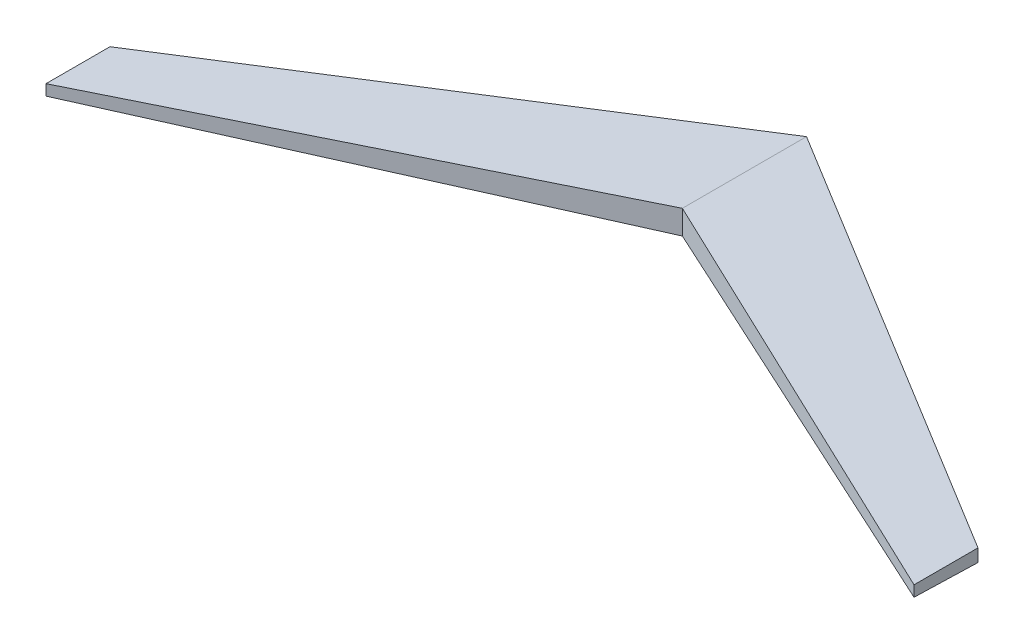
ISO-10303-21;
HEADER;
FILE_DESCRIPTION(('STEP AP214'),'2;1');
FILE_NAME('part.step','',(''),(''),'','','');
FILE_SCHEMA(('AUTOMOTIVE_DESIGN { 1 0 10303 214 1 1 1 1 }'));
ENDSEC;
DATA;
#1=APPLICATION_CONTEXT('core data for automotive mechanical design processes');
#2=APPLICATION_PROTOCOL_DEFINITION('international standard','automotive_design',2000,#1);
#3=PRODUCT_CONTEXT('',#1,'mechanical');
#4=PRODUCT('Part','Part','',(#3));
#5=PRODUCT_RELATED_PRODUCT_CATEGORY('part','',(#4));
#6=PRODUCT_DEFINITION_FORMATION('','',#4);
#7=PRODUCT_DEFINITION_CONTEXT('part definition',#1,'design');
#8=PRODUCT_DEFINITION('design','',#6,#7);
#9=PRODUCT_DEFINITION_SHAPE('','',#8);
#10=(LENGTH_UNIT() NAMED_UNIT(*) SI_UNIT(.MILLI.,.METRE.));
#11=(NAMED_UNIT(*) PLANE_ANGLE_UNIT() SI_UNIT($,.RADIAN.));
#12=(NAMED_UNIT(*) SI_UNIT($,.STERADIAN.) SOLID_ANGLE_UNIT());
#13=UNCERTAINTY_MEASURE_WITH_UNIT(LENGTH_MEASURE(1.E-05),#10,'distance_accuracy_value','');
#14=(GEOMETRIC_REPRESENTATION_CONTEXT(3) GLOBAL_UNCERTAINTY_ASSIGNED_CONTEXT((#13)) GLOBAL_UNIT_ASSIGNED_CONTEXT((#10,
#11,#12)) REPRESENTATION_CONTEXT('',''));
#15=CARTESIAN_POINT('',(0.,0.,0.));
#16=DIRECTION('',(0.,0.,1.));
#17=DIRECTION('',(1.,0.,0.));
#18=AXIS2_PLACEMENT_3D('',#15,#16,#17);
#19=CARTESIAN_POINT('',(-17711.940475464,-80.385008705711,13165.1515428862));
#20=CARTESIAN_POINT('',(0.,-298.277774528723,4907.09615841033));
#21=CARTESIAN_POINT('',(-17711.940475464,-85.1826870549582,12943.9386021868));
#22=CARTESIAN_POINT('',(0.,-321.894328297356,4276.67474022297));
#23=CARTESIAN_POINT('',(-17711.940475464,-89.9803654042046,12722.7256614874));
#24=CARTESIAN_POINT('',(0.,-345.510882065988,3646.25332203561));
#25=CARTESIAN_POINT('',(-17711.940475464,-99.5757221026959,12280.2997800886));
#26=CARTESIAN_POINT('',(0.,-392.743989603252,2385.41048566089));
#27=CARTESIAN_POINT('',(-17711.940475464,-104.373400451941,12059.0868393893));
#28=CARTESIAN_POINT('',(0.,-416.360543371884,1754.98906747353));
#29=CARTESIAN_POINT('',(-17711.940475464,-109.171078801185,11837.87389869));
#30=CARTESIAN_POINT('',(0.,-439.977097140517,1124.56764928617));
#31=B_SPLINE_SURFACE_WITH_KNOTS('',3,1,((#19,#20),(#21,#22),(#23,#24),(#25,#26),(#27,#28),(#29,
#30)),.UNSPECIFIED.,.F.,.F.,.F.,(4,2,4),(2,2),(0.,0.5,1.),(0.,1.),.UNSPECIFIED.);
#32=DIRECTION('',(0.906274153509529,-0.0111490088946297,-0.422543321188791));
#33=VECTOR('',#32,1.);
#34=CARTESIAN_POINT('',(-17711.940475464,-80.385008705711,13165.1515428862));
#35=LINE('',#34,#33);
#36=CARTESIAN_POINT('',(-13224.5432432146,-135.589089570586,11072.9372579865));
#37=VERTEX_POINT('',#36);
#38=CARTESIAN_POINT('',(0.,-298.277774528723,4907.09615841033));
#39=VERTEX_POINT('',#38);
#40=EDGE_CURVE('E231',#37,#39,#35,.T.);
#41=CARTESIAN_POINT('',(-13224.5432432146,-135.589089570586,11072.9372579865));
#42=CARTESIAN_POINT('',(-13224.5432432146,-145.154611939406,10748.0495679373));
#43=CARTESIAN_POINT('',(-13224.5432432146,-154.720134308226,10423.1618778881));
#44=CARTESIAN_POINT('',(-13224.5432432146,-169.068417861456,9935.83034281433));
#45=CARTESIAN_POINT('',(-13224.5432432146,-173.851179045866,9773.38649778973));
#46=CARTESIAN_POINT('',(-13224.5432432146,-183.416701414686,9448.49880774054));
#47=CARTESIAN_POINT('',(-13224.5432432146,-188.199462599097,9286.05496271594));
#48=CARTESIAN_POINT('',(-13224.5432432146,-192.982223783507,9123.61111769134));
#49=B_SPLINE_CURVE_WITH_KNOTS('',3,(#41,#42,#43,#44,#45,#46,#47,#48),.UNSPECIFIED.,.F.,.F.,(4,2,
2,4),(0.,975.085428705194,1462.6281430578,1950.17085741039),.UNSPECIFIED.);
#50=CARTESIAN_POINT('',(-13224.5432432146,-192.982223783507,9123.61111769134));
#51=VERTEX_POINT('',#50);
#52=EDGE_CURVE('E219',#37,#51,#49,.T.);
#53=DIRECTION('',(0.85554228604483,-0.0159789684004121,-0.517486298715285));
#54=VECTOR('',#53,1.);
#55=CARTESIAN_POINT('',(-8855.970237732,-274.574087970851,6481.22077398808));
#56=LINE('',#55,#54);
#57=CARTESIAN_POINT('',(0.,-439.977097140517,1124.56764928617));
#58=VERTEX_POINT('',#57);
#59=EDGE_CURVE('E113',#51,#58,#56,.T.);
#60=DIRECTION('',(0.,0.037435276099573,0.9992990543893));
#61=VECTOR('',#60,1.);
#62=CARTESIAN_POINT('',(0.,-369.12743583462,3015.83190384825));
#63=LINE('',#62,#61);
#64=EDGE_CURVE('E241',#58,#39,#63,.T.);
#65=ORIENTED_EDGE('',*,*,#40,.F.);
#66=ORIENTED_EDGE('',*,*,#52,.T.);
#67=ORIENTED_EDGE('',*,*,#59,.T.);
#68=ORIENTED_EDGE('',*,*,#64,.T.);
#69=EDGE_LOOP('',(#65,#66,#67,#68));
#70=FACE_BOUND('',#69,.T.);
#71=ADVANCED_FACE('F103',(#70),#31,.T.);
#72=CARTESIAN_POINT('',(1879.35745301163,-4.88727022556857E-12,4030.8602679557));
#73=DIRECTION('',(-0.422569584789028,0.,-0.906330483880592));
#74=DIRECTION('',(-0.906330483880592,0.,0.422569584789028));
#75=AXIS2_PLACEMENT_3D('',#72,#73,#74);
#76=PLANE('',#75);
#77=DIRECTION('',(0.,1.,0.));
#78=VECTOR('',#77,1.);
#79=CARTESIAN_POINT('',(-13224.5432432146,-1.34255302771863E-11,11072.9372579865));
#80=LINE('',#79,#78);
#81=CARTESIAN_POINT('',(-13224.5432432146,193.981843528122,11072.9372579865));
#82=VERTEX_POINT('',#81);
#83=EDGE_CURVE('E119',#37,#82,#80,.T.);
#84=ORIENTED_EDGE('',*,*,#83,.F.);
#85=ORIENTED_EDGE('',*,*,#40,.T.);
#86=DIRECTION('',(0.,-1.,0.));
#87=VECTOR('',#86,1.);
#88=CARTESIAN_POINT('',(0.,434.262669847546,4907.09615841033));
#89=LINE('',#88,#87);
#90=CARTESIAN_POINT('',(0.,434.262669847546,4907.09615841033));
#91=VERTEX_POINT('',#90);
#92=EDGE_CURVE('E239',#91,#39,#89,.T.);
#93=ORIENTED_EDGE('',*,*,#92,.F.);
#94=DIRECTION('',(0.90620762167093,0.016465167238481,-0.422512301233143));
#95=VECTOR('',#94,1.);
#96=CARTESIAN_POINT('',(-17711.940475464,112.448931944077,13165.1515428862));
#97=LINE('',#96,#95);
#98=EDGE_CURVE('E226',#82,#91,#97,.T.);
#99=ORIENTED_EDGE('',*,*,#98,.F.);
#100=EDGE_LOOP('',(#84,#85,#93,#99));
#101=FACE_BOUND('',#100,.T.);
#102=ADVANCED_FACE('F236',(#101),#76,.F.);
#103=CARTESIAN_POINT('',(498.008577383891,2.09116891696483E-13,823.340439781124));
#104=DIRECTION('',(0.517552375592634,0.,0.855651528671819));
#105=DIRECTION('',(0.855651528671819,0.,-0.517552375592634));
#106=AXIS2_PLACEMENT_3D('',#103,#104,#105);
#107=PLANE('',#106);
#108=DIRECTION('',(0.,-1.,0.));
#109=VECTOR('',#108,1.);
#110=CARTESIAN_POINT('',(-13224.5432432146,2.31726890335459E-12,9123.61111769134));
#111=LINE('',#110,#109);
#112=CARTESIAN_POINT('',(-13224.5432432146,193.981843528122,9123.61111769134));
#113=VERTEX_POINT('',#112);
#114=EDGE_CURVE('E169',#113,#51,#111,.T.);
#115=ORIENTED_EDGE('',*,*,#114,.F.);
#116=DIRECTION('',(0.85554814333413,0.01554471947013,-0.517489841575772));
#117=VECTOR('',#116,1.);
#118=CARTESIAN_POINT('',(-17711.940475464,112.448931944077,11837.87389869));
#119=LINE('',#118,#117);
#120=CARTESIAN_POINT('',(1.77635683940025E-12,434.262669847546,1124.56764928618));
#121=VERTEX_POINT('',#120);
#122=EDGE_CURVE('E228',#113,#121,#119,.T.);
#123=ORIENTED_EDGE('',*,*,#122,.T.);
#124=DIRECTION('',(0.,1.,0.));
#125=VECTOR('',#124,1.);
#126=CARTESIAN_POINT('',(0.,434.262669847546,1124.56764928617));
#127=LINE('',#126,#125);
#128=EDGE_CURVE('E177',#58,#121,#127,.T.);
#129=ORIENTED_EDGE('',*,*,#128,.F.);
#130=ORIENTED_EDGE('',*,*,#59,.F.);
#131=EDGE_LOOP('',(#115,#123,#129,#130));
#132=FACE_BOUND('',#131,.T.);
#133=ADVANCED_FACE('F257',(#132),#107,.F.);
#134=CARTESIAN_POINT('',(-7.88764918619134,434.119356703998,0.));
#135=DIRECTION('',(0.0181663117209599,-0.999834978943254,0.));
#136=DIRECTION('',(0.999834978943254,0.0181663117209599,0.));
#137=AXIS2_PLACEMENT_3D('',#134,#135,#136);
#138=PLANE('',#137);
#139=DIRECTION('',(0.,0.,-1.));
#140=VECTOR('',#139,1.);
#141=CARTESIAN_POINT('',(-13224.5432432146,193.981843528122,0.));
#142=LINE('',#141,#140);
#143=EDGE_CURVE('E13',#82,#113,#142,.T.);
#144=ORIENTED_EDGE('',*,*,#143,.F.);
#145=ORIENTED_EDGE('',*,*,#98,.T.);
#146=DIRECTION('',(0.,0.,1.));
#147=VECTOR('',#146,1.);
#148=CARTESIAN_POINT('',(0.,434.262669847546,4907.09615841033));
#149=LINE('',#148,#147);
#150=EDGE_CURVE('E178',#121,#91,#149,.T.);
#151=ORIENTED_EDGE('',*,*,#150,.F.);
#152=ORIENTED_EDGE('',*,*,#122,.F.);
#153=EDGE_LOOP('',(#144,#145,#151,#152));
#154=FACE_BOUND('',#153,.T.);
#155=ADVANCED_FACE('F216',(#154),#138,.F.);
#156=CARTESIAN_POINT('',(-13224.5432432146,0.,-2590.80000000001));
#157=DIRECTION('',(-1.,0.,0.));
#158=DIRECTION('',(0.,0.,1.));
#159=AXIS2_PLACEMENT_3D('',#156,#157,#158);
#160=PLANE('',#159);
#161=ORIENTED_EDGE('',*,*,#83,.T.);
#162=ORIENTED_EDGE('',*,*,#143,.T.);
#163=ORIENTED_EDGE('',*,*,#114,.T.);
#164=ORIENTED_EDGE('',*,*,#52,.F.);
#165=EDGE_LOOP('',(#161,#162,#163,#164));
#166=FACE_BOUND('',#165,.T.);
#167=ADVANCED_FACE('F205',(#166),#160,.T.);
#168=CARTESIAN_POINT('',(17711.940475464,-80.385008705711,13165.1515428862));
#169=CARTESIAN_POINT('',(0.,-298.277774528723,4907.09615841033));
#170=CARTESIAN_POINT('',(17711.940475464,-85.1826870549582,12943.9386021868));
#171=CARTESIAN_POINT('',(0.,-321.894328297356,4276.67474022297));
#172=CARTESIAN_POINT('',(17711.940475464,-89.9803654042046,12722.7256614874));
#173=CARTESIAN_POINT('',(0.,-345.510882065988,3646.25332203561));
#174=CARTESIAN_POINT('',(17711.940475464,-99.5757221026959,12280.2997800886));
#175=CARTESIAN_POINT('',(0.,-392.743989603252,2385.41048566089));
#176=CARTESIAN_POINT('',(17711.940475464,-104.373400451941,12059.0868393893));
#177=CARTESIAN_POINT('',(0.,-416.360543371884,1754.98906747353));
#178=CARTESIAN_POINT('',(17711.940475464,-109.171078801185,11837.87389869));
#179=CARTESIAN_POINT('',(0.,-439.977097140517,1124.56764928617));
#180=B_SPLINE_SURFACE_WITH_KNOTS('',3,1,((#168,#169),(#170,#171),(#172,#173),(#174,#175),(#176,
#177),(#178,#179)),.UNSPECIFIED.,.F.,.F.,.F.,(4,2,4),(2,2),(0.,0.5,1.),(0.,1.),.UNSPECIFIED.);
#181=DIRECTION('',(-0.906274153509529,-0.0111490088946297,-0.422543321188791));
#182=VECTOR('',#181,1.);
#183=CARTESIAN_POINT('',(17711.940475464,-80.385008705711,13165.1515428862));
#184=LINE('',#183,#182);
#185=CARTESIAN_POINT('',(13224.5432432146,-135.589089570586,11072.9372579865));
#186=VERTEX_POINT('',#185);
#187=EDGE_CURVE('E247',#186,#39,#184,.T.);
#188=DIRECTION('',(-0.85554228604483,-0.0159789684004121,-0.517486298715285));
#189=VECTOR('',#188,1.);
#190=CARTESIAN_POINT('',(8855.970237732,-274.574087970851,6481.22077398808));
#191=LINE('',#190,#189);
#192=CARTESIAN_POINT('',(13224.5432432146,-192.982223783507,9123.61111769134));
#193=VERTEX_POINT('',#192);
#194=EDGE_CURVE('E170',#193,#58,#191,.T.);
#195=CARTESIAN_POINT('',(13224.5432432146,-135.589089570586,11072.9372579865));
#196=CARTESIAN_POINT('',(13224.5432432146,-145.154611939406,10748.0495679373));
#197=CARTESIAN_POINT('',(13224.5432432146,-154.720134308226,10423.1618778881));
#198=CARTESIAN_POINT('',(13224.5432432146,-169.068417861456,9935.83034281433));
#199=CARTESIAN_POINT('',(13224.5432432146,-173.851179045866,9773.38649778973));
#200=CARTESIAN_POINT('',(13224.5432432146,-183.416701414686,9448.49880774054));
#201=CARTESIAN_POINT('',(13224.5432432146,-188.199462599097,9286.05496271594));
#202=CARTESIAN_POINT('',(13224.5432432146,-192.982223783507,9123.61111769134));
#203=B_SPLINE_CURVE_WITH_KNOTS('',3,(#195,#196,#197,#198,#199,#200,#201,#202),.UNSPECIFIED.,.F.,
.F.,(4,2,2,4),(0.,975.085428705194,1462.6281430578,1950.17085741039),.UNSPECIFIED.);
#204=EDGE_CURVE('E182',#186,#193,#203,.T.);
#205=ORIENTED_EDGE('',*,*,#187,.T.);
#206=ORIENTED_EDGE('',*,*,#64,.F.);
#207=ORIENTED_EDGE('',*,*,#194,.F.);
#208=ORIENTED_EDGE('',*,*,#204,.F.);
#209=EDGE_LOOP('',(#205,#206,#207,#208));
#210=FACE_BOUND('',#209,.T.);
#211=ADVANCED_FACE('F197',(#210),#180,.F.);
#212=CARTESIAN_POINT('',(-1879.35745301163,-4.88727022556857E-12,4030.8602679557));
#213=DIRECTION('',(0.422569584789028,0.,-0.906330483880592));
#214=DIRECTION('',(0.906330483880592,0.,0.422569584789028));
#215=AXIS2_PLACEMENT_3D('',#212,#213,#214);
#216=PLANE('',#215);
#217=DIRECTION('',(0.,1.,0.));
#218=VECTOR('',#217,1.);
#219=CARTESIAN_POINT('',(13224.5432432146,-1.34255302771863E-11,11072.9372579865));
#220=LINE('',#219,#218);
#221=CARTESIAN_POINT('',(13224.5432432146,193.981843528122,11072.9372579865));
#222=VERTEX_POINT('',#221);
#223=EDGE_CURVE('E184',#186,#222,#220,.T.);
#224=ORIENTED_EDGE('',*,*,#223,.T.);
#225=DIRECTION('',(-0.90620762167093,0.016465167238481,-0.422512301233143));
#226=VECTOR('',#225,1.);
#227=CARTESIAN_POINT('',(17711.940475464,112.448931944077,13165.1515428862));
#228=LINE('',#227,#226);
#229=EDGE_CURVE('E165',#222,#91,#228,.T.);
#230=ORIENTED_EDGE('',*,*,#229,.T.);
#231=ORIENTED_EDGE('',*,*,#92,.T.);
#232=ORIENTED_EDGE('',*,*,#187,.F.);
#233=EDGE_LOOP('',(#224,#230,#231,#232));
#234=FACE_BOUND('',#233,.T.);
#235=ADVANCED_FACE('F204',(#234),#216,.F.);
#236=CARTESIAN_POINT('',(-498.008577383891,2.09116891696483E-13,823.340439781124));
#237=DIRECTION('',(-0.517552375592634,0.,0.855651528671819));
#238=DIRECTION('',(-0.855651528671819,0.,-0.517552375592634));
#239=AXIS2_PLACEMENT_3D('',#236,#237,#238);
#240=PLANE('',#239);
#241=DIRECTION('',(0.,-1.,0.));
#242=VECTOR('',#241,1.);
#243=CARTESIAN_POINT('',(13224.5432432146,2.31726890335459E-12,9123.61111769134));
#244=LINE('',#243,#242);
#245=CARTESIAN_POINT('',(13224.5432432146,193.981843528122,9123.61111769134));
#246=VERTEX_POINT('',#245);
#247=EDGE_CURVE('E175',#246,#193,#244,.T.);
#248=ORIENTED_EDGE('',*,*,#247,.T.);
#249=ORIENTED_EDGE('',*,*,#194,.T.);
#250=ORIENTED_EDGE('',*,*,#128,.T.);
#251=DIRECTION('',(-0.85554814333413,0.01554471947013,-0.517489841575772));
#252=VECTOR('',#251,1.);
#253=CARTESIAN_POINT('',(17711.940475464,112.448931944077,11837.87389869));
#254=LINE('',#253,#252);
#255=EDGE_CURVE('E162',#246,#121,#254,.T.);
#256=ORIENTED_EDGE('',*,*,#255,.F.);
#257=EDGE_LOOP('',(#248,#249,#250,#256));
#258=FACE_BOUND('',#257,.T.);
#259=ADVANCED_FACE('F173',(#258),#240,.F.);
#260=CARTESIAN_POINT('',(7.88764918619134,434.119356703998,0.));
#261=DIRECTION('',(-0.0181663117209599,-0.999834978943254,0.));
#262=DIRECTION('',(-0.999834978943254,0.0181663117209599,0.));
#263=AXIS2_PLACEMENT_3D('',#260,#261,#262);
#264=PLANE('',#263);
#265=DIRECTION('',(0.,0.,-1.));
#266=VECTOR('',#265,1.);
#267=CARTESIAN_POINT('',(13224.5432432146,193.981843528122,0.));
#268=LINE('',#267,#266);
#269=EDGE_CURVE('E158',#222,#246,#268,.T.);
#270=ORIENTED_EDGE('',*,*,#269,.T.);
#271=ORIENTED_EDGE('',*,*,#255,.T.);
#272=ORIENTED_EDGE('',*,*,#150,.T.);
#273=ORIENTED_EDGE('',*,*,#229,.F.);
#274=EDGE_LOOP('',(#270,#271,#272,#273));
#275=FACE_BOUND('',#274,.T.);
#276=ADVANCED_FACE('F160',(#275),#264,.F.);
#277=CARTESIAN_POINT('',(13224.5432432146,0.,-2590.80000000001));
#278=DIRECTION('',(1.,0.,0.));
#279=DIRECTION('',(0.,0.,1.));
#280=AXIS2_PLACEMENT_3D('',#277,#278,#279);
#281=PLANE('',#280);
#282=ORIENTED_EDGE('',*,*,#223,.F.);
#283=ORIENTED_EDGE('',*,*,#204,.T.);
#284=ORIENTED_EDGE('',*,*,#247,.F.);
#285=ORIENTED_EDGE('',*,*,#269,.F.);
#286=EDGE_LOOP('',(#282,#283,#284,#285));
#287=FACE_BOUND('',#286,.T.);
#288=ADVANCED_FACE('F180',(#287),#281,.T.);
#289=CLOSED_SHELL('',(#71,#102,#133,#155,#167,#211,#235,#259,#276,#288));
#290=MANIFOLD_SOLID_BREP('B2',#289);
#291=ADVANCED_BREP_SHAPE_REPRESENTATION('',(#18,#290),#14);
#292=SHAPE_DEFINITION_REPRESENTATION(#9,#291);
ENDSEC;
END-ISO-10303-21;
